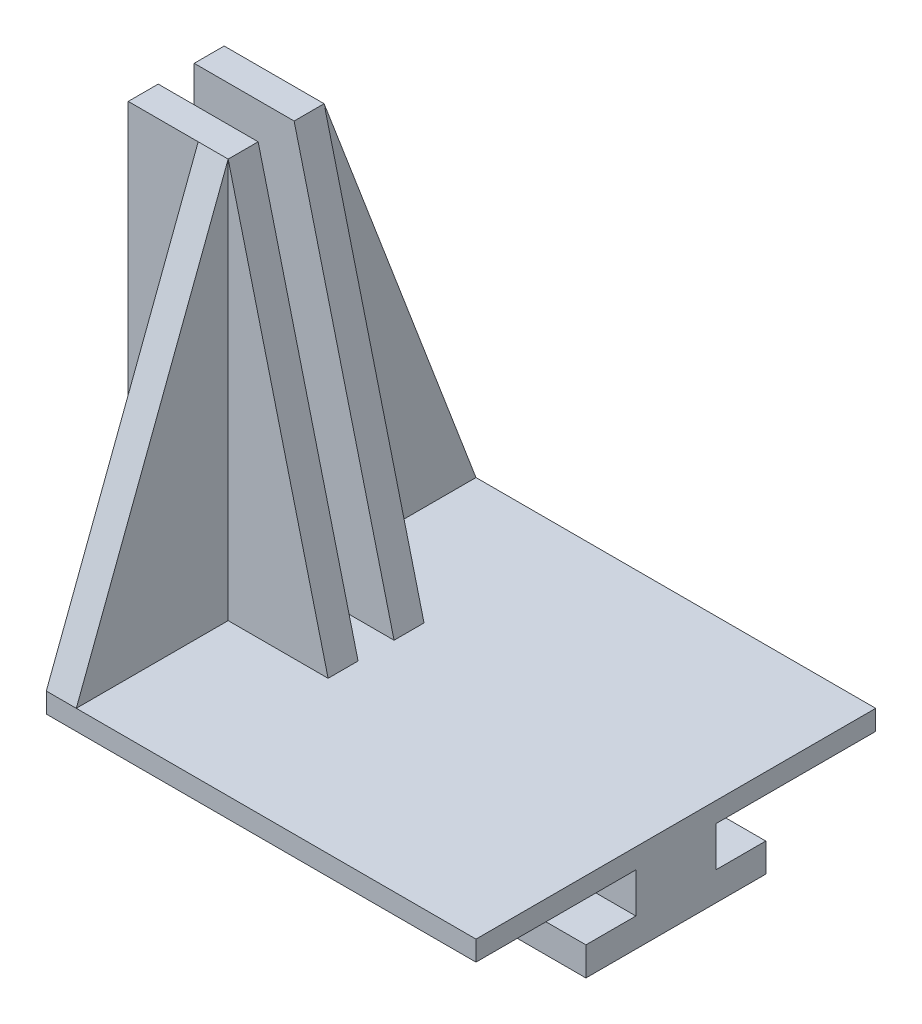
ISO-10303-21;
HEADER;
FILE_DESCRIPTION(('STEP AP214'),'2;1');
FILE_NAME('part.step','',(''),(''),'','','');
FILE_SCHEMA(('AUTOMOTIVE_DESIGN { 1 0 10303 214 1 1 1 1 }'));
ENDSEC;
DATA;
#1=APPLICATION_CONTEXT('core data for automotive mechanical design processes');
#2=APPLICATION_PROTOCOL_DEFINITION('international standard','automotive_design',2000,#1);
#3=PRODUCT_CONTEXT('',#1,'mechanical');
#4=PRODUCT('Part','Part','',(#3));
#5=PRODUCT_RELATED_PRODUCT_CATEGORY('part','',(#4));
#6=PRODUCT_DEFINITION_FORMATION('','',#4);
#7=PRODUCT_DEFINITION_CONTEXT('part definition',#1,'design');
#8=PRODUCT_DEFINITION('design','',#6,#7);
#9=PRODUCT_DEFINITION_SHAPE('','',#8);
#10=(LENGTH_UNIT() NAMED_UNIT(*) SI_UNIT(.MILLI.,.METRE.));
#11=(NAMED_UNIT(*) PLANE_ANGLE_UNIT() SI_UNIT($,.RADIAN.));
#12=(NAMED_UNIT(*) SI_UNIT($,.STERADIAN.) SOLID_ANGLE_UNIT());
#13=UNCERTAINTY_MEASURE_WITH_UNIT(LENGTH_MEASURE(1.E-05),#10,'distance_accuracy_value','');
#14=(GEOMETRIC_REPRESENTATION_CONTEXT(3) GLOBAL_UNCERTAINTY_ASSIGNED_CONTEXT((#13)) GLOBAL_UNIT_ASSIGNED_CONTEXT((#10,
#11,#12)) REPRESENTATION_CONTEXT('',''));
#15=CARTESIAN_POINT('',(0.,0.,0.));
#16=DIRECTION('',(0.,0.,1.));
#17=DIRECTION('',(1.,0.,0.));
#18=AXIS2_PLACEMENT_3D('',#15,#16,#17);
#19=CARTESIAN_POINT('',(0.,1.,0.));
#20=DIRECTION('',(0.,-1.,0.));
#21=DIRECTION('',(0.,0.,-1.));
#22=AXIS2_PLACEMENT_3D('',#19,#20,#21);
#23=PLANE('',#22);
#24=DIRECTION('',(-1.,0.,0.));
#25=VECTOR('',#24,1.);
#26=CARTESIAN_POINT('',(-5.,1.,0.899999999999999));
#27=LINE('',#26,#25);
#28=CARTESIAN_POINT('',(-5.,1.,0.899999999999999));
#29=VERTEX_POINT('',#28);
#30=CARTESIAN_POINT('',(-10.,1.,0.899999999999998));
#31=VERTEX_POINT('',#30);
#32=EDGE_CURVE('E248',#29,#31,#27,.T.);
#33=ORIENTED_EDGE('',*,*,#32,.F.);
#34=DIRECTION('',(0.,0.,1.));
#35=VECTOR('',#34,1.);
#36=CARTESIAN_POINT('',(-5.,1.,0.));
#37=LINE('',#36,#35);
#38=CARTESIAN_POINT('',(-5.,1.,2.4));
#39=VERTEX_POINT('',#38);
#40=EDGE_CURVE('E59',#29,#39,#37,.T.);
#41=ORIENTED_EDGE('',*,*,#40,.T.);
#42=DIRECTION('',(-1.,0.,0.));
#43=VECTOR('',#42,1.);
#44=CARTESIAN_POINT('',(-5.,1.,2.4));
#45=LINE('',#44,#43);
#46=CARTESIAN_POINT('',(-10.,1.,2.39999999999999));
#47=VERTEX_POINT('',#46);
#48=EDGE_CURVE('E269',#39,#47,#45,.T.);
#49=ORIENTED_EDGE('',*,*,#48,.T.);
#50=DIRECTION('',(0.,0.,-1.));
#51=VECTOR('',#50,1.);
#52=CARTESIAN_POINT('',(-10.,1.,10.));
#53=LINE('',#52,#51);
#54=CARTESIAN_POINT('',(-9.99999999999999,1.,10.));
#55=VERTEX_POINT('',#54);
#56=EDGE_CURVE('E291',#55,#47,#53,.T.);
#57=ORIENTED_EDGE('',*,*,#56,.F.);
#58=DIRECTION('',(1.,0.,0.));
#59=VECTOR('',#58,1.);
#60=CARTESIAN_POINT('',(10.,1.,10.));
#61=LINE('',#60,#59);
#62=CARTESIAN_POINT('',(10.,1.,10.));
#63=VERTEX_POINT('',#62);
#64=EDGE_CURVE('E420',#55,#63,#61,.T.);
#65=ORIENTED_EDGE('',*,*,#64,.T.);
#66=DIRECTION('',(0.,0.,-1.));
#67=VECTOR('',#66,1.);
#68=CARTESIAN_POINT('',(10.,1.,-10.));
#69=LINE('',#68,#67);
#70=CARTESIAN_POINT('',(10.,1.,-10.));
#71=VERTEX_POINT('',#70);
#72=EDGE_CURVE('E423',#63,#71,#69,.T.);
#73=ORIENTED_EDGE('',*,*,#72,.T.);
#74=DIRECTION('',(-1.,0.,0.));
#75=VECTOR('',#74,1.);
#76=CARTESIAN_POINT('',(10.,1.,-10.));
#77=LINE('',#76,#75);
#78=CARTESIAN_POINT('',(-10.,1.,-10.));
#79=VERTEX_POINT('',#78);
#80=EDGE_CURVE('E425',#71,#79,#77,.T.);
#81=ORIENTED_EDGE('',*,*,#80,.T.);
#82=DIRECTION('',(0.,0.,1.));
#83=VECTOR('',#82,1.);
#84=CARTESIAN_POINT('',(-10.,1.,-10.));
#85=LINE('',#84,#83);
#86=CARTESIAN_POINT('',(-10.,1.,-2.4));
#87=VERTEX_POINT('',#86);
#88=EDGE_CURVE('E396',#79,#87,#85,.T.);
#89=ORIENTED_EDGE('',*,*,#88,.T.);
#90=DIRECTION('',(-1.,0.,0.));
#91=VECTOR('',#90,1.);
#92=CARTESIAN_POINT('',(-5.,1.,-2.4));
#93=LINE('',#92,#91);
#94=CARTESIAN_POINT('',(-5.,1.,-2.4));
#95=VERTEX_POINT('',#94);
#96=EDGE_CURVE('E352',#95,#87,#93,.T.);
#97=ORIENTED_EDGE('',*,*,#96,.F.);
#98=DIRECTION('',(0.,0.,-1.));
#99=VECTOR('',#98,1.);
#100=CARTESIAN_POINT('',(-5.,1.,0.));
#101=LINE('',#100,#99);
#102=CARTESIAN_POINT('',(-5.,1.,-0.899999999999999));
#103=VERTEX_POINT('',#102);
#104=EDGE_CURVE('E333',#103,#95,#101,.T.);
#105=ORIENTED_EDGE('',*,*,#104,.F.);
#106=DIRECTION('',(-1.,0.,0.));
#107=VECTOR('',#106,1.);
#108=CARTESIAN_POINT('',(-5.,1.,-0.899999999999999));
#109=LINE('',#108,#107);
#110=CARTESIAN_POINT('',(-10.,1.,-0.899999999999998));
#111=VERTEX_POINT('',#110);
#112=EDGE_CURVE('E339',#103,#111,#109,.T.);
#113=ORIENTED_EDGE('',*,*,#112,.T.);
#114=EDGE_CURVE('E408',#111,#31,#85,.T.);
#115=ORIENTED_EDGE('',*,*,#114,.T.);
#116=EDGE_LOOP('',(#33,#41,#49,#57,#65,#73,#81,#89,#97,#105,#113,#115));
#117=FACE_BOUND('',#116,.T.);
#118=ADVANCED_FACE('F33',(#117),#23,.F.);
#119=CARTESIAN_POINT('',(-10.,1.,-10.));
#120=DIRECTION('',(1.,0.,0.));
#121=DIRECTION('',(0.,0.,-1.));
#122=AXIS2_PLACEMENT_3D('',#119,#120,#121);
#123=PLANE('',#122);
#124=DIRECTION('',(0.,-1.,0.));
#125=VECTOR('',#124,1.);
#126=CARTESIAN_POINT('',(-10.,0.,2.));
#127=LINE('',#126,#125);
#128=CARTESIAN_POINT('',(-10.,0.,2.));
#129=VERTEX_POINT('',#128);
#130=CARTESIAN_POINT('',(-10.,-2.,2.));
#131=VERTEX_POINT('',#130);
#132=EDGE_CURVE('E478',#129,#131,#127,.T.);
#133=ORIENTED_EDGE('',*,*,#132,.F.);
#134=DIRECTION('',(0.,0.,-1.));
#135=VECTOR('',#134,1.);
#136=CARTESIAN_POINT('',(-10.,0.,0.));
#137=LINE('',#136,#135);
#138=CARTESIAN_POINT('',(-10.,0.,0.899999999999998));
#139=VERTEX_POINT('',#138);
#140=EDGE_CURVE('E51',#129,#139,#137,.T.);
#141=ORIENTED_EDGE('',*,*,#140,.T.);
#142=DIRECTION('',(0.,1.,0.));
#143=VECTOR('',#142,1.);
#144=CARTESIAN_POINT('',(-10.,0.,0.899999999999998));
#145=LINE('',#144,#143);
#146=EDGE_CURVE('E311',#139,#31,#145,.T.);
#147=ORIENTED_EDGE('',*,*,#146,.T.);
#148=ORIENTED_EDGE('',*,*,#114,.F.);
#149=DIRECTION('',(0.,1.,0.));
#150=VECTOR('',#149,1.);
#151=CARTESIAN_POINT('',(-10.,0.,-0.899999999999998));
#152=LINE('',#151,#150);
#153=CARTESIAN_POINT('',(-10.,0.,-0.899999999999998));
#154=VERTEX_POINT('',#153);
#155=EDGE_CURVE('E37',#154,#111,#152,.T.);
#156=ORIENTED_EDGE('',*,*,#155,.F.);
#157=DIRECTION('',(0.,0.,1.));
#158=VECTOR('',#157,1.);
#159=CARTESIAN_POINT('',(-10.,0.,0.));
#160=LINE('',#159,#158);
#161=CARTESIAN_POINT('',(-10.,0.,-2.));
#162=VERTEX_POINT('',#161);
#163=EDGE_CURVE('E11',#162,#154,#160,.T.);
#164=ORIENTED_EDGE('',*,*,#163,.F.);
#165=DIRECTION('',(0.,1.,0.));
#166=VECTOR('',#165,1.);
#167=CARTESIAN_POINT('',(-10.,-2.,-2.));
#168=LINE('',#167,#166);
#169=CARTESIAN_POINT('',(-10.,-2.,-2.));
#170=VERTEX_POINT('',#169);
#171=EDGE_CURVE('E490',#170,#162,#168,.T.);
#172=ORIENTED_EDGE('',*,*,#171,.F.);
#173=DIRECTION('',(0.,0.,1.));
#174=VECTOR('',#173,1.);
#175=CARTESIAN_POINT('',(-10.,-2.,-4.5));
#176=LINE('',#175,#174);
#177=CARTESIAN_POINT('',(-10.,-2.,-4.5));
#178=VERTEX_POINT('',#177);
#179=EDGE_CURVE('E487',#178,#170,#176,.T.);
#180=ORIENTED_EDGE('',*,*,#179,.F.);
#181=DIRECTION('',(0.,1.,0.));
#182=VECTOR('',#181,1.);
#183=CARTESIAN_POINT('',(-10.,-3.43610218622617,-4.5));
#184=LINE('',#183,#182);
#185=CARTESIAN_POINT('',(-10.,-3.43610218622617,-4.5));
#186=VERTEX_POINT('',#185);
#187=EDGE_CURVE('E484',#186,#178,#184,.T.);
#188=ORIENTED_EDGE('',*,*,#187,.F.);
#189=DIRECTION('',(0.,0.,-1.));
#190=VECTOR('',#189,1.);
#191=CARTESIAN_POINT('',(-10.,-3.43610218622617,4.5));
#192=LINE('',#191,#190);
#193=CARTESIAN_POINT('',(-10.,-3.43610218622617,4.5));
#194=VERTEX_POINT('',#193);
#195=EDGE_CURVE('E481',#194,#186,#192,.T.);
#196=ORIENTED_EDGE('',*,*,#195,.F.);
#197=DIRECTION('',(0.,-1.,0.));
#198=VECTOR('',#197,1.);
#199=CARTESIAN_POINT('',(-10.,-2.,4.5));
#200=LINE('',#199,#198);
#201=CARTESIAN_POINT('',(-10.,-2.,4.5));
#202=VERTEX_POINT('',#201);
#203=EDGE_CURVE('E477',#202,#194,#200,.T.);
#204=ORIENTED_EDGE('',*,*,#203,.F.);
#205=DIRECTION('',(0.,0.,1.));
#206=VECTOR('',#205,1.);
#207=CARTESIAN_POINT('',(-10.,-2.,2.));
#208=LINE('',#207,#206);
#209=EDGE_CURVE('E474',#131,#202,#208,.T.);
#210=ORIENTED_EDGE('',*,*,#209,.F.);
#211=EDGE_LOOP('',(#133,#141,#147,#148,#156,#164,#172,#180,#188,#196,#204,#210));
#212=FACE_BOUND('',#211,.T.);
#213=ADVANCED_FACE('F35',(#212),#123,.F.);
#214=CARTESIAN_POINT('',(0.,0.,0.));
#215=DIRECTION('',(0.,-1.,0.));
#216=DIRECTION('',(0.,0.,-1.));
#217=AXIS2_PLACEMENT_3D('',#214,#215,#216);
#218=PLANE('',#217);
#219=DIRECTION('',(1.,0.,0.));
#220=VECTOR('',#219,1.);
#221=CARTESIAN_POINT('',(10.,0.,10.));
#222=LINE('',#221,#220);
#223=CARTESIAN_POINT('',(-11.5,0.,10.));
#224=VERTEX_POINT('',#223);
#225=CARTESIAN_POINT('',(10.,0.,10.));
#226=VERTEX_POINT('',#225);
#227=EDGE_CURVE('E428',#224,#226,#222,.T.);
#228=ORIENTED_EDGE('',*,*,#227,.F.);
#229=DIRECTION('',(0.,0.,-1.));
#230=VECTOR('',#229,1.);
#231=CARTESIAN_POINT('',(-11.5,0.,0.));
#232=LINE('',#231,#230);
#233=CARTESIAN_POINT('',(-11.5,0.,0.899999999999998));
#234=VERTEX_POINT('',#233);
#235=EDGE_CURVE('E609',#224,#234,#232,.T.);
#236=ORIENTED_EDGE('',*,*,#235,.T.);
#237=DIRECTION('',(1.,0.,0.));
#238=VECTOR('',#237,1.);
#239=CARTESIAN_POINT('',(-11.5,0.,0.899999999999998));
#240=LINE('',#239,#238);
#241=EDGE_CURVE('E308',#234,#139,#240,.T.);
#242=ORIENTED_EDGE('',*,*,#241,.T.);
#243=ORIENTED_EDGE('',*,*,#140,.F.);
#244=DIRECTION('',(1.,0.,0.));
#245=VECTOR('',#244,1.);
#246=CARTESIAN_POINT('',(-10.,0.,2.));
#247=LINE('',#246,#245);
#248=CARTESIAN_POINT('',(10.,0.,2.));
#249=VERTEX_POINT('',#248);
#250=EDGE_CURVE('E431',#129,#249,#247,.T.);
#251=ORIENTED_EDGE('',*,*,#250,.T.);
#252=DIRECTION('',(0.,0.,-1.));
#253=VECTOR('',#252,1.);
#254=CARTESIAN_POINT('',(10.,0.,-10.));
#255=LINE('',#254,#253);
#256=EDGE_CURVE('E439',#226,#249,#255,.T.);
#257=ORIENTED_EDGE('',*,*,#256,.F.);
#258=EDGE_LOOP('',(#228,#236,#242,#243,#251,#257));
#259=FACE_BOUND('',#258,.T.);
#260=ADVANCED_FACE('F548',(#259),#218,.T.);
#261=CARTESIAN_POINT('',(10.,1.,10.));
#262=DIRECTION('',(0.,0.,-1.));
#263=DIRECTION('',(-1.,0.,0.));
#264=AXIS2_PLACEMENT_3D('',#261,#262,#263);
#265=PLANE('',#264);
#266=ORIENTED_EDGE('',*,*,#227,.T.);
#267=DIRECTION('',(0.,-1.,0.));
#268=VECTOR('',#267,1.);
#269=CARTESIAN_POINT('',(10.,1.,10.));
#270=LINE('',#269,#268);
#271=EDGE_CURVE('E43',#63,#226,#270,.T.);
#272=ORIENTED_EDGE('',*,*,#271,.F.);
#273=ORIENTED_EDGE('',*,*,#64,.F.);
#274=DIRECTION('',(1.,0.,0.));
#275=VECTOR('',#274,1.);
#276=CARTESIAN_POINT('',(-11.5,1.,10.));
#277=LINE('',#276,#275);
#278=CARTESIAN_POINT('',(-11.5,1.,10.));
#279=VERTEX_POINT('',#278);
#280=EDGE_CURVE('E296',#279,#55,#277,.T.);
#281=ORIENTED_EDGE('',*,*,#280,.F.);
#282=DIRECTION('',(0.,-1.,0.));
#283=VECTOR('',#282,1.);
#284=CARTESIAN_POINT('',(-11.5,0.,10.));
#285=LINE('',#284,#283);
#286=EDGE_CURVE('E606',#279,#224,#285,.T.);
#287=ORIENTED_EDGE('',*,*,#286,.T.);
#288=EDGE_LOOP('',(#266,#272,#273,#281,#287));
#289=FACE_BOUND('',#288,.T.);
#290=ADVANCED_FACE('F598',(#289),#265,.F.);
#291=CARTESIAN_POINT('',(10.,1.,-10.));
#292=DIRECTION('',(-1.,0.,0.));
#293=DIRECTION('',(0.,0.,1.));
#294=AXIS2_PLACEMENT_3D('',#291,#292,#293);
#295=PLANE('',#294);
#296=ORIENTED_EDGE('',*,*,#256,.T.);
#297=DIRECTION('',(0.,-1.,0.));
#298=VECTOR('',#297,1.);
#299=CARTESIAN_POINT('',(10.,0.,2.));
#300=LINE('',#299,#298);
#301=CARTESIAN_POINT('',(10.,-2.,2.));
#302=VERTEX_POINT('',#301);
#303=EDGE_CURVE('E388',#249,#302,#300,.T.);
#304=ORIENTED_EDGE('',*,*,#303,.T.);
#305=DIRECTION('',(0.,0.,1.));
#306=VECTOR('',#305,1.);
#307=CARTESIAN_POINT('',(10.,-2.,2.));
#308=LINE('',#307,#306);
#309=CARTESIAN_POINT('',(10.,-2.,4.5));
#310=VERTEX_POINT('',#309);
#311=EDGE_CURVE('E491',#302,#310,#308,.T.);
#312=ORIENTED_EDGE('',*,*,#311,.T.);
#313=DIRECTION('',(0.,-1.,0.));
#314=VECTOR('',#313,1.);
#315=CARTESIAN_POINT('',(10.,-2.,4.5));
#316=LINE('',#315,#314);
#317=CARTESIAN_POINT('',(10.,-3.43610218622617,4.5));
#318=VERTEX_POINT('',#317);
#319=EDGE_CURVE('E494',#310,#318,#316,.T.);
#320=ORIENTED_EDGE('',*,*,#319,.T.);
#321=DIRECTION('',(0.,0.,-1.));
#322=VECTOR('',#321,1.);
#323=CARTESIAN_POINT('',(10.,-3.43610218622617,4.5));
#324=LINE('',#323,#322);
#325=CARTESIAN_POINT('',(10.,-3.43610218622617,-4.5));
#326=VERTEX_POINT('',#325);
#327=EDGE_CURVE('E497',#318,#326,#324,.T.);
#328=ORIENTED_EDGE('',*,*,#327,.T.);
#329=DIRECTION('',(0.,1.,0.));
#330=VECTOR('',#329,1.);
#331=CARTESIAN_POINT('',(10.,-3.43610218622617,-4.5));
#332=LINE('',#331,#330);
#333=CARTESIAN_POINT('',(10.,-2.,-4.5));
#334=VERTEX_POINT('',#333);
#335=EDGE_CURVE('E500',#326,#334,#332,.T.);
#336=ORIENTED_EDGE('',*,*,#335,.T.);
#337=DIRECTION('',(0.,0.,1.));
#338=VECTOR('',#337,1.);
#339=CARTESIAN_POINT('',(10.,-2.,-4.5));
#340=LINE('',#339,#338);
#341=CARTESIAN_POINT('',(10.,-2.,-2.));
#342=VERTEX_POINT('',#341);
#343=EDGE_CURVE('E503',#334,#342,#340,.T.);
#344=ORIENTED_EDGE('',*,*,#343,.T.);
#345=DIRECTION('',(0.,1.,0.));
#346=VECTOR('',#345,1.);
#347=CARTESIAN_POINT('',(10.,-2.,-2.));
#348=LINE('',#347,#346);
#349=CARTESIAN_POINT('',(10.,0.,-2.));
#350=VERTEX_POINT('',#349);
#351=EDGE_CURVE('E506',#342,#350,#348,.T.);
#352=ORIENTED_EDGE('',*,*,#351,.T.);
#353=CARTESIAN_POINT('',(10.,0.,-10.));
#354=VERTEX_POINT('',#353);
#355=EDGE_CURVE('E430',#350,#354,#255,.T.);
#356=ORIENTED_EDGE('',*,*,#355,.T.);
#357=DIRECTION('',(0.,-1.,0.));
#358=VECTOR('',#357,1.);
#359=CARTESIAN_POINT('',(10.,1.,-10.));
#360=LINE('',#359,#358);
#361=EDGE_CURVE('E427',#71,#354,#360,.T.);
#362=ORIENTED_EDGE('',*,*,#361,.F.);
#363=ORIENTED_EDGE('',*,*,#72,.F.);
#364=ORIENTED_EDGE('',*,*,#271,.T.);
#365=EDGE_LOOP('',(#296,#304,#312,#320,#328,#336,#344,#352,#356,#362,#363,#364));
#366=FACE_BOUND('',#365,.T.);
#367=ADVANCED_FACE('F530',(#366),#295,.F.);
#368=CARTESIAN_POINT('',(10.,1.,-10.));
#369=DIRECTION('',(0.,0.,1.));
#370=DIRECTION('',(1.,0.,0.));
#371=AXIS2_PLACEMENT_3D('',#368,#369,#370);
#372=PLANE('',#371);
#373=DIRECTION('',(-1.,0.,0.));
#374=VECTOR('',#373,1.);
#375=CARTESIAN_POINT('',(10.,0.,-10.));
#376=LINE('',#375,#374);
#377=CARTESIAN_POINT('',(-11.5,0.,-10.));
#378=VERTEX_POINT('',#377);
#379=EDGE_CURVE('E413',#354,#378,#376,.T.);
#380=ORIENTED_EDGE('',*,*,#379,.T.);
#381=DIRECTION('',(0.,-1.,0.));
#382=VECTOR('',#381,1.);
#383=CARTESIAN_POINT('',(-11.5,0.,-10.));
#384=LINE('',#383,#382);
#385=CARTESIAN_POINT('',(-11.5,1.,-10.));
#386=VERTEX_POINT('',#385);
#387=EDGE_CURVE('E464',#386,#378,#384,.T.);
#388=ORIENTED_EDGE('',*,*,#387,.F.);
#389=DIRECTION('',(1.,0.,0.));
#390=VECTOR('',#389,1.);
#391=CARTESIAN_POINT('',(-11.5,1.,-10.));
#392=LINE('',#391,#390);
#393=EDGE_CURVE('E389',#386,#79,#392,.T.);
#394=ORIENTED_EDGE('',*,*,#393,.T.);
#395=ORIENTED_EDGE('',*,*,#80,.F.);
#396=ORIENTED_EDGE('',*,*,#361,.T.);
#397=EDGE_LOOP('',(#380,#388,#394,#395,#396));
#398=FACE_BOUND('',#397,.T.);
#399=ADVANCED_FACE('F448',(#398),#372,.F.);
#400=DIRECTION('',(1.,0.,0.));
#401=VECTOR('',#400,1.);
#402=CARTESIAN_POINT('',(-10.,0.,-2.));
#403=LINE('',#402,#401);
#404=EDGE_CURVE('E515',#162,#350,#403,.T.);
#405=ORIENTED_EDGE('',*,*,#404,.F.);
#406=ORIENTED_EDGE('',*,*,#163,.T.);
#407=DIRECTION('',(1.,0.,0.));
#408=VECTOR('',#407,1.);
#409=CARTESIAN_POINT('',(-11.5,0.,-0.899999999999998));
#410=LINE('',#409,#408);
#411=CARTESIAN_POINT('',(-11.5,0.,-0.899999999999998));
#412=VERTEX_POINT('',#411);
#413=EDGE_CURVE('E461',#412,#154,#410,.T.);
#414=ORIENTED_EDGE('',*,*,#413,.F.);
#415=DIRECTION('',(0.,0.,1.));
#416=VECTOR('',#415,1.);
#417=CARTESIAN_POINT('',(-11.5,0.,0.));
#418=LINE('',#417,#416);
#419=EDGE_CURVE('E459',#378,#412,#418,.T.);
#420=ORIENTED_EDGE('',*,*,#419,.F.);
#421=ORIENTED_EDGE('',*,*,#379,.F.);
#422=ORIENTED_EDGE('',*,*,#355,.F.);
#423=EDGE_LOOP('',(#405,#406,#414,#420,#421,#422));
#424=FACE_BOUND('',#423,.T.);
#425=ADVANCED_FACE('F457',(#424),#218,.T.);
#426=CARTESIAN_POINT('',(-10.,0.,2.));
#427=DIRECTION('',(0.,0.,1.));
#428=DIRECTION('',(0.,-1.,0.));
#429=AXIS2_PLACEMENT_3D('',#426,#427,#428);
#430=PLANE('',#429);
#431=ORIENTED_EDGE('',*,*,#303,.F.);
#432=ORIENTED_EDGE('',*,*,#250,.F.);
#433=ORIENTED_EDGE('',*,*,#132,.T.);
#434=DIRECTION('',(1.,0.,0.));
#435=VECTOR('',#434,1.);
#436=CARTESIAN_POINT('',(-10.,-2.,2.));
#437=LINE('',#436,#435);
#438=EDGE_CURVE('E418',#131,#302,#437,.T.);
#439=ORIENTED_EDGE('',*,*,#438,.T.);
#440=EDGE_LOOP('',(#431,#432,#433,#439));
#441=FACE_BOUND('',#440,.T.);
#442=ADVANCED_FACE('F552',(#441),#430,.T.);
#443=CARTESIAN_POINT('',(-10.,-2.,-2.));
#444=DIRECTION('',(0.,0.,-1.));
#445=DIRECTION('',(-1.,0.,0.));
#446=AXIS2_PLACEMENT_3D('',#443,#444,#445);
#447=PLANE('',#446);
#448=ORIENTED_EDGE('',*,*,#351,.F.);
#449=DIRECTION('',(1.,0.,0.));
#450=VECTOR('',#449,1.);
#451=CARTESIAN_POINT('',(-10.,-2.,-2.));
#452=LINE('',#451,#450);
#453=EDGE_CURVE('E522',#170,#342,#452,.T.);
#454=ORIENTED_EDGE('',*,*,#453,.F.);
#455=ORIENTED_EDGE('',*,*,#171,.T.);
#456=ORIENTED_EDGE('',*,*,#404,.T.);
#457=EDGE_LOOP('',(#448,#454,#455,#456));
#458=FACE_BOUND('',#457,.T.);
#459=ADVANCED_FACE('F533',(#458),#447,.T.);
#460=CARTESIAN_POINT('',(-10.,-2.,-4.5));
#461=DIRECTION('',(0.,1.,0.));
#462=DIRECTION('',(0.,0.,1.));
#463=AXIS2_PLACEMENT_3D('',#460,#461,#462);
#464=PLANE('',#463);
#465=ORIENTED_EDGE('',*,*,#343,.F.);
#466=DIRECTION('',(1.,0.,0.));
#467=VECTOR('',#466,1.);
#468=CARTESIAN_POINT('',(-10.,-2.,-4.5));
#469=LINE('',#468,#467);
#470=EDGE_CURVE('E566',#178,#334,#469,.T.);
#471=ORIENTED_EDGE('',*,*,#470,.F.);
#472=ORIENTED_EDGE('',*,*,#179,.T.);
#473=ORIENTED_EDGE('',*,*,#453,.T.);
#474=EDGE_LOOP('',(#465,#471,#472,#473));
#475=FACE_BOUND('',#474,.T.);
#476=ADVANCED_FACE('F568',(#475),#464,.T.);
#477=CARTESIAN_POINT('',(-10.,-3.43610218622617,-4.5));
#478=DIRECTION('',(0.,0.,-1.));
#479=DIRECTION('',(-1.,0.,0.));
#480=AXIS2_PLACEMENT_3D('',#477,#478,#479);
#481=PLANE('',#480);
#482=ORIENTED_EDGE('',*,*,#335,.F.);
#483=DIRECTION('',(1.,0.,0.));
#484=VECTOR('',#483,1.);
#485=CARTESIAN_POINT('',(-10.,-3.43610218622617,-4.5));
#486=LINE('',#485,#484);
#487=EDGE_CURVE('E562',#186,#326,#486,.T.);
#488=ORIENTED_EDGE('',*,*,#487,.F.);
#489=ORIENTED_EDGE('',*,*,#187,.T.);
#490=ORIENTED_EDGE('',*,*,#470,.T.);
#491=EDGE_LOOP('',(#482,#488,#489,#490));
#492=FACE_BOUND('',#491,.T.);
#493=ADVANCED_FACE('F572',(#492),#481,.T.);
#494=CARTESIAN_POINT('',(-10.,-3.43610218622617,4.5));
#495=DIRECTION('',(0.,-1.,0.));
#496=DIRECTION('',(0.,0.,-1.));
#497=AXIS2_PLACEMENT_3D('',#494,#495,#496);
#498=PLANE('',#497);
#499=ORIENTED_EDGE('',*,*,#327,.F.);
#500=DIRECTION('',(1.,0.,0.));
#501=VECTOR('',#500,1.);
#502=CARTESIAN_POINT('',(-10.,-3.43610218622617,4.5));
#503=LINE('',#502,#501);
#504=EDGE_CURVE('E561',#194,#318,#503,.T.);
#505=ORIENTED_EDGE('',*,*,#504,.F.);
#506=ORIENTED_EDGE('',*,*,#195,.T.);
#507=ORIENTED_EDGE('',*,*,#487,.T.);
#508=EDGE_LOOP('',(#499,#505,#506,#507));
#509=FACE_BOUND('',#508,.T.);
#510=ADVANCED_FACE('F575',(#509),#498,.T.);
#511=CARTESIAN_POINT('',(-10.,-2.,4.5));
#512=DIRECTION('',(0.,0.,1.));
#513=DIRECTION('',(1.,0.,0.));
#514=AXIS2_PLACEMENT_3D('',#511,#512,#513);
#515=PLANE('',#514);
#516=ORIENTED_EDGE('',*,*,#319,.F.);
#517=DIRECTION('',(1.,0.,0.));
#518=VECTOR('',#517,1.);
#519=CARTESIAN_POINT('',(-10.,-2.,4.5));
#520=LINE('',#519,#518);
#521=EDGE_CURVE('E559',#202,#310,#520,.T.);
#522=ORIENTED_EDGE('',*,*,#521,.F.);
#523=ORIENTED_EDGE('',*,*,#203,.T.);
#524=ORIENTED_EDGE('',*,*,#504,.T.);
#525=EDGE_LOOP('',(#516,#522,#523,#524));
#526=FACE_BOUND('',#525,.T.);
#527=ADVANCED_FACE('F577',(#526),#515,.T.);
#528=CARTESIAN_POINT('',(-10.,-2.,2.));
#529=DIRECTION('',(0.,1.,0.));
#530=DIRECTION('',(0.,0.,1.));
#531=AXIS2_PLACEMENT_3D('',#528,#529,#530);
#532=PLANE('',#531);
#533=ORIENTED_EDGE('',*,*,#311,.F.);
#534=ORIENTED_EDGE('',*,*,#438,.F.);
#535=ORIENTED_EDGE('',*,*,#209,.T.);
#536=ORIENTED_EDGE('',*,*,#521,.T.);
#537=EDGE_LOOP('',(#533,#534,#535,#536));
#538=FACE_BOUND('',#537,.T.);
#539=ADVANCED_FACE('F558',(#538),#532,.T.);
#540=CARTESIAN_POINT('',(-11.5,3.44669695910521,-9.07025515554002));
#541=DIRECTION('',(0.,-0.355217760623572,0.934783580588349));
#542=DIRECTION('',(0.,-0.934783580588349,-0.355217760623572));
#543=AXIS2_PLACEMENT_3D('',#540,#541,#542);
#544=PLANE('',#543);
#545=DIRECTION('',(0.,-0.934783580588349,-0.355217760623573));
#546=VECTOR('',#545,1.);
#547=CARTESIAN_POINT('',(-10.,3.44669695910521,-9.07025515554002));
#548=LINE('',#547,#546);
#549=CARTESIAN_POINT('',(-9.99999999999999,21.,-2.4));
#550=VERTEX_POINT('',#549);
#551=EDGE_CURVE('E384',#550,#79,#548,.T.);
#552=ORIENTED_EDGE('',*,*,#551,.T.);
#553=ORIENTED_EDGE('',*,*,#393,.F.);
#554=DIRECTION('',(0.,-0.934783580588349,-0.355217760623573));
#555=VECTOR('',#554,1.);
#556=CARTESIAN_POINT('',(-11.5,3.44669695910521,-9.07025515554002));
#557=LINE('',#556,#555);
#558=CARTESIAN_POINT('',(-11.5,21.,-2.4));
#559=VERTEX_POINT('',#558);
#560=EDGE_CURVE('E386',#559,#386,#557,.T.);
#561=ORIENTED_EDGE('',*,*,#560,.F.);
#562=DIRECTION('',(1.,0.,0.));
#563=VECTOR('',#562,1.);
#564=CARTESIAN_POINT('',(-11.5,21.,-2.4));
#565=LINE('',#564,#563);
#566=EDGE_CURVE('E361',#559,#550,#565,.T.);
#567=ORIENTED_EDGE('',*,*,#566,.T.);
#568=EDGE_LOOP('',(#552,#553,#561,#567));
#569=FACE_BOUND('',#568,.T.);
#570=ADVANCED_FACE('F382',(#569),#544,.F.);
#571=CARTESIAN_POINT('',(-11.5,0.,-0.899999999999998));
#572=DIRECTION('',(0.,0.,-1.));
#573=DIRECTION('',(-1.,0.,0.));
#574=AXIS2_PLACEMENT_3D('',#571,#572,#573);
#575=PLANE('',#574);
#576=ORIENTED_EDGE('',*,*,#155,.T.);
#577=ORIENTED_EDGE('',*,*,#112,.F.);
#578=DIRECTION('',(0.242535625036333,-0.970142500145332,0.));
#579=VECTOR('',#578,1.);
#580=CARTESIAN_POINT('',(-5.,1.,-0.9));
#581=LINE('',#580,#579);
#582=CARTESIAN_POINT('',(-9.99999999999999,21.,-0.9));
#583=VERTEX_POINT('',#582);
#584=EDGE_CURVE('E294',#583,#103,#581,.T.);
#585=ORIENTED_EDGE('',*,*,#584,.F.);
#586=DIRECTION('',(-1.,0.,0.));
#587=VECTOR('',#586,1.);
#588=CARTESIAN_POINT('',(-5.,21.,-0.899999999999999));
#589=LINE('',#588,#587);
#590=CARTESIAN_POINT('',(-15.,21.,-0.899999999999997));
#591=VERTEX_POINT('',#590);
#592=EDGE_CURVE('E336',#583,#591,#589,.T.);
#593=ORIENTED_EDGE('',*,*,#592,.T.);
#594=DIRECTION('',(0.,1.,0.));
#595=VECTOR('',#594,1.);
#596=CARTESIAN_POINT('',(-15.,0.,-0.899999999999997));
#597=LINE('',#596,#595);
#598=CARTESIAN_POINT('',(-15.,1.,-0.899999999999997));
#599=VERTEX_POINT('',#598);
#600=EDGE_CURVE('E330',#599,#591,#597,.T.);
#601=ORIENTED_EDGE('',*,*,#600,.F.);
#602=CARTESIAN_POINT('',(-11.5,1.,-0.899999999999998));
#603=VERTEX_POINT('',#602);
#604=EDGE_CURVE('E346',#603,#599,#109,.T.);
#605=ORIENTED_EDGE('',*,*,#604,.F.);
#606=DIRECTION('',(0.,1.,0.));
#607=VECTOR('',#606,1.);
#608=CARTESIAN_POINT('',(-11.5,0.,-0.899999999999998));
#609=LINE('',#608,#607);
#610=EDGE_CURVE('E463',#412,#603,#609,.T.);
#611=ORIENTED_EDGE('',*,*,#610,.F.);
#612=ORIENTED_EDGE('',*,*,#413,.T.);
#613=EDGE_LOOP('',(#576,#577,#585,#593,#601,#605,#611,#612));
#614=FACE_BOUND('',#613,.T.);
#615=ADVANCED_FACE('F373',(#614),#575,.F.);
#616=CARTESIAN_POINT('',(-11.5,0.,0.));
#617=DIRECTION('',(-1.,0.,0.));
#618=DIRECTION('',(0.,0.,1.));
#619=AXIS2_PLACEMENT_3D('',#616,#617,#618);
#620=PLANE('',#619);
#621=DIRECTION('',(0.,-1.,0.));
#622=VECTOR('',#621,1.);
#623=CARTESIAN_POINT('',(-11.5,0.,-2.39999999999999));
#624=LINE('',#623,#622);
#625=CARTESIAN_POINT('',(-11.5,1.,-2.4));
#626=VERTEX_POINT('',#625);
#627=EDGE_CURVE('E398',#559,#626,#624,.T.);
#628=ORIENTED_EDGE('',*,*,#627,.F.);
#629=ORIENTED_EDGE('',*,*,#560,.T.);
#630=ORIENTED_EDGE('',*,*,#387,.T.);
#631=ORIENTED_EDGE('',*,*,#419,.T.);
#632=ORIENTED_EDGE('',*,*,#610,.T.);
#633=DIRECTION('',(0.,0.,-1.));
#634=VECTOR('',#633,1.);
#635=CARTESIAN_POINT('',(-11.5,1.,0.));
#636=LINE('',#635,#634);
#637=EDGE_CURVE('E402',#603,#626,#636,.T.);
#638=ORIENTED_EDGE('',*,*,#637,.T.);
#639=EDGE_LOOP('',(#628,#629,#630,#631,#632,#638));
#640=FACE_BOUND('',#639,.T.);
#641=ADVANCED_FACE('F471',(#640),#620,.T.);
#642=CARTESIAN_POINT('',(-10.,0.,0.));
#643=DIRECTION('',(-1.,0.,0.));
#644=DIRECTION('',(0.,0.,1.));
#645=AXIS2_PLACEMENT_3D('',#642,#643,#644);
#646=PLANE('',#645);
#647=ORIENTED_EDGE('',*,*,#88,.F.);
#648=ORIENTED_EDGE('',*,*,#551,.F.);
#649=DIRECTION('',(0.,-1.,0.));
#650=VECTOR('',#649,1.);
#651=CARTESIAN_POINT('',(-10.,0.,-2.39999999999999));
#652=LINE('',#651,#650);
#653=EDGE_CURVE('E338',#550,#87,#652,.T.);
#654=ORIENTED_EDGE('',*,*,#653,.T.);
#655=EDGE_LOOP('',(#647,#648,#654));
#656=FACE_BOUND('',#655,.T.);
#657=ADVANCED_FACE('F394',(#656),#646,.F.);
#658=CARTESIAN_POINT('',(-5.,0.,-2.4));
#659=DIRECTION('',(0.,0.,-1.));
#660=DIRECTION('',(-1.,0.,0.));
#661=AXIS2_PLACEMENT_3D('',#658,#659,#660);
#662=PLANE('',#661);
#663=ORIENTED_EDGE('',*,*,#653,.F.);
#664=DIRECTION('',(-0.242535625036333,0.970142500145332,0.));
#665=VECTOR('',#664,1.);
#666=CARTESIAN_POINT('',(-4.76470588235294,0.0588235294117643,-2.4));
#667=LINE('',#666,#665);
#668=EDGE_CURVE('E318',#95,#550,#667,.T.);
#669=ORIENTED_EDGE('',*,*,#668,.F.);
#670=ORIENTED_EDGE('',*,*,#96,.T.);
#671=EDGE_LOOP('',(#663,#669,#670));
#672=FACE_BOUND('',#671,.T.);
#673=ADVANCED_FACE('F542',(#672),#662,.T.);
#674=CARTESIAN_POINT('',(-5.,21.,0.));
#675=DIRECTION('',(0.,1.,0.));
#676=DIRECTION('',(0.,0.,1.));
#677=AXIS2_PLACEMENT_3D('',#674,#675,#676);
#678=PLANE('',#677);
#679=DIRECTION('',(0.,0.,1.));
#680=VECTOR('',#679,1.);
#681=CARTESIAN_POINT('',(-9.99999999999999,21.,-5.9));
#682=LINE('',#681,#680);
#683=EDGE_CURVE('E316',#550,#583,#682,.T.);
#684=ORIENTED_EDGE('',*,*,#683,.F.);
#685=ORIENTED_EDGE('',*,*,#566,.F.);
#686=DIRECTION('',(-1.,0.,0.));
#687=VECTOR('',#686,1.);
#688=CARTESIAN_POINT('',(-5.,21.,-2.4));
#689=LINE('',#688,#687);
#690=CARTESIAN_POINT('',(-15.,21.,-2.4));
#691=VERTEX_POINT('',#690);
#692=EDGE_CURVE('E335',#559,#691,#689,.T.);
#693=ORIENTED_EDGE('',*,*,#692,.T.);
#694=DIRECTION('',(0.,0.,-1.));
#695=VECTOR('',#694,1.);
#696=CARTESIAN_POINT('',(-15.,21.,0.));
#697=LINE('',#696,#695);
#698=EDGE_CURVE('E321',#591,#691,#697,.T.);
#699=ORIENTED_EDGE('',*,*,#698,.F.);
#700=ORIENTED_EDGE('',*,*,#592,.F.);
#701=EDGE_LOOP('',(#684,#685,#693,#699,#700));
#702=FACE_BOUND('',#701,.T.);
#703=ADVANCED_FACE('F358',(#702),#678,.T.);
#704=CARTESIAN_POINT('',(-5.,1.,0.));
#705=DIRECTION('',(0.,1.,0.));
#706=DIRECTION('',(0.,0.,1.));
#707=AXIS2_PLACEMENT_3D('',#704,#705,#706);
#708=PLANE('',#707);
#709=ORIENTED_EDGE('',*,*,#637,.F.);
#710=ORIENTED_EDGE('',*,*,#604,.T.);
#711=DIRECTION('',(0.,0.,-1.));
#712=VECTOR('',#711,1.);
#713=CARTESIAN_POINT('',(-15.,1.,0.));
#714=LINE('',#713,#712);
#715=CARTESIAN_POINT('',(-15.,1.,-2.4));
#716=VERTEX_POINT('',#715);
#717=EDGE_CURVE('E327',#599,#716,#714,.T.);
#718=ORIENTED_EDGE('',*,*,#717,.T.);
#719=EDGE_CURVE('E350',#626,#716,#93,.T.);
#720=ORIENTED_EDGE('',*,*,#719,.F.);
#721=EDGE_LOOP('',(#709,#710,#718,#720));
#722=FACE_BOUND('',#721,.T.);
#723=ADVANCED_FACE('F470',(#722),#708,.F.);
#724=ORIENTED_EDGE('',*,*,#692,.F.);
#725=ORIENTED_EDGE('',*,*,#627,.T.);
#726=ORIENTED_EDGE('',*,*,#719,.T.);
#727=DIRECTION('',(0.,-1.,0.));
#728=VECTOR('',#727,1.);
#729=CARTESIAN_POINT('',(-15.,0.,-2.39999999999999));
#730=LINE('',#729,#728);
#731=EDGE_CURVE('E324',#691,#716,#730,.T.);
#732=ORIENTED_EDGE('',*,*,#731,.F.);
#733=EDGE_LOOP('',(#724,#725,#726,#732));
#734=FACE_BOUND('',#733,.T.);
#735=ADVANCED_FACE('F364',(#734),#662,.T.);
#736=CARTESIAN_POINT('',(-15.,0.,0.));
#737=DIRECTION('',(-1.,0.,0.));
#738=DIRECTION('',(0.,0.,1.));
#739=AXIS2_PLACEMENT_3D('',#736,#737,#738);
#740=PLANE('',#739);
#741=ORIENTED_EDGE('',*,*,#698,.T.);
#742=ORIENTED_EDGE('',*,*,#731,.T.);
#743=ORIENTED_EDGE('',*,*,#717,.F.);
#744=ORIENTED_EDGE('',*,*,#600,.T.);
#745=EDGE_LOOP('',(#741,#742,#743,#744));
#746=FACE_BOUND('',#745,.T.);
#747=ADVANCED_FACE('F368',(#746),#740,.T.);
#748=CARTESIAN_POINT('',(-5.,1.,-5.9));
#749=DIRECTION('',(-0.970142500145332,-0.242535625036333,0.));
#750=DIRECTION('',(0.242535625036333,-0.970142500145332,0.));
#751=AXIS2_PLACEMENT_3D('',#748,#749,#750);
#752=PLANE('',#751);
#753=ORIENTED_EDGE('',*,*,#668,.T.);
#754=ORIENTED_EDGE('',*,*,#683,.T.);
#755=ORIENTED_EDGE('',*,*,#584,.T.);
#756=ORIENTED_EDGE('',*,*,#104,.T.);
#757=EDGE_LOOP('',(#753,#754,#755,#756));
#758=FACE_BOUND('',#757,.T.);
#759=ADVANCED_FACE('F540',(#758),#752,.F.);
#760=CARTESIAN_POINT('',(-11.5,3.44669695910521,9.07025515554002));
#761=DIRECTION('',(0.,-0.355217760623572,-0.934783580588349));
#762=DIRECTION('',(0.,-0.934783580588349,0.355217760623572));
#763=AXIS2_PLACEMENT_3D('',#760,#761,#762);
#764=PLANE('',#763);
#765=DIRECTION('',(0.,-0.934783580588349,0.355217760623573));
#766=VECTOR('',#765,1.);
#767=CARTESIAN_POINT('',(-10.,3.44669695910521,9.07025515554002));
#768=LINE('',#767,#766);
#769=CARTESIAN_POINT('',(-9.99999999999999,21.,2.4));
#770=VERTEX_POINT('',#769);
#771=EDGE_CURVE('E251',#770,#55,#768,.T.);
#772=ORIENTED_EDGE('',*,*,#771,.F.);
#773=DIRECTION('',(1.,0.,0.));
#774=VECTOR('',#773,1.);
#775=CARTESIAN_POINT('',(-11.5,21.,2.4));
#776=LINE('',#775,#774);
#777=CARTESIAN_POINT('',(-11.5,21.,2.4));
#778=VERTEX_POINT('',#777);
#779=EDGE_CURVE('E230',#778,#770,#776,.T.);
#780=ORIENTED_EDGE('',*,*,#779,.F.);
#781=DIRECTION('',(0.,-0.934783580588349,0.355217760623573));
#782=VECTOR('',#781,1.);
#783=CARTESIAN_POINT('',(-11.5,3.44669695910521,9.07025515554002));
#784=LINE('',#783,#782);
#785=EDGE_CURVE('E610',#778,#279,#784,.T.);
#786=ORIENTED_EDGE('',*,*,#785,.T.);
#787=ORIENTED_EDGE('',*,*,#280,.T.);
#788=EDGE_LOOP('',(#772,#780,#786,#787));
#789=FACE_BOUND('',#788,.T.);
#790=ADVANCED_FACE('F624',(#789),#764,.F.);
#791=CARTESIAN_POINT('',(-11.5,0.,0.899999999999998));
#792=DIRECTION('',(0.,0.,1.));
#793=DIRECTION('',(-1.,0.,0.));
#794=AXIS2_PLACEMENT_3D('',#791,#792,#793);
#795=PLANE('',#794);
#796=ORIENTED_EDGE('',*,*,#146,.F.);
#797=ORIENTED_EDGE('',*,*,#241,.F.);
#798=DIRECTION('',(0.,1.,0.));
#799=VECTOR('',#798,1.);
#800=CARTESIAN_POINT('',(-11.5,0.,0.899999999999998));
#801=LINE('',#800,#799);
#802=CARTESIAN_POINT('',(-11.5,1.,0.899999999999998));
#803=VERTEX_POINT('',#802);
#804=EDGE_CURVE('E612',#234,#803,#801,.T.);
#805=ORIENTED_EDGE('',*,*,#804,.T.);
#806=CARTESIAN_POINT('',(-15.,1.,0.899999999999997));
#807=VERTEX_POINT('',#806);
#808=EDGE_CURVE('E253',#803,#807,#27,.T.);
#809=ORIENTED_EDGE('',*,*,#808,.T.);
#810=DIRECTION('',(0.,1.,0.));
#811=VECTOR('',#810,1.);
#812=CARTESIAN_POINT('',(-15.,0.,0.899999999999997));
#813=LINE('',#812,#811);
#814=CARTESIAN_POINT('',(-15.,21.,0.899999999999997));
#815=VERTEX_POINT('',#814);
#816=EDGE_CURVE('E246',#807,#815,#813,.T.);
#817=ORIENTED_EDGE('',*,*,#816,.T.);
#818=DIRECTION('',(-1.,0.,0.));
#819=VECTOR('',#818,1.);
#820=CARTESIAN_POINT('',(-5.,21.,0.899999999999999));
#821=LINE('',#820,#819);
#822=CARTESIAN_POINT('',(-9.99999999999999,21.,0.9));
#823=VERTEX_POINT('',#822);
#824=EDGE_CURVE('E227',#823,#815,#821,.T.);
#825=ORIENTED_EDGE('',*,*,#824,.F.);
#826=DIRECTION('',(0.242535625036333,-0.970142500145332,0.));
#827=VECTOR('',#826,1.);
#828=CARTESIAN_POINT('',(-5.,1.,0.9));
#829=LINE('',#828,#827);
#830=EDGE_CURVE('E235',#823,#29,#829,.T.);
#831=ORIENTED_EDGE('',*,*,#830,.T.);
#832=ORIENTED_EDGE('',*,*,#32,.T.);
#833=EDGE_LOOP('',(#796,#797,#805,#809,#817,#825,#831,#832));
#834=FACE_BOUND('',#833,.T.);
#835=ADVANCED_FACE('F243',(#834),#795,.F.);
#836=CARTESIAN_POINT('',(-11.5,0.,0.));
#837=DIRECTION('',(-1.,0.,0.));
#838=DIRECTION('',(0.,0.,-1.));
#839=AXIS2_PLACEMENT_3D('',#836,#837,#838);
#840=PLANE('',#839);
#841=DIRECTION('',(0.,-1.,0.));
#842=VECTOR('',#841,1.);
#843=CARTESIAN_POINT('',(-11.5,0.,2.39999999999999));
#844=LINE('',#843,#842);
#845=CARTESIAN_POINT('',(-11.5,1.,2.4));
#846=VERTEX_POINT('',#845);
#847=EDGE_CURVE('E313',#778,#846,#844,.T.);
#848=ORIENTED_EDGE('',*,*,#847,.T.);
#849=DIRECTION('',(0.,0.,1.));
#850=VECTOR('',#849,1.);
#851=CARTESIAN_POINT('',(-11.5,1.,0.));
#852=LINE('',#851,#850);
#853=EDGE_CURVE('E617',#803,#846,#852,.T.);
#854=ORIENTED_EDGE('',*,*,#853,.F.);
#855=ORIENTED_EDGE('',*,*,#804,.F.);
#856=ORIENTED_EDGE('',*,*,#235,.F.);
#857=ORIENTED_EDGE('',*,*,#286,.F.);
#858=ORIENTED_EDGE('',*,*,#785,.F.);
#859=EDGE_LOOP('',(#848,#854,#855,#856,#857,#858));
#860=FACE_BOUND('',#859,.T.);
#861=ADVANCED_FACE('F625',(#860),#840,.T.);
#862=CARTESIAN_POINT('',(-10.,0.,0.));
#863=DIRECTION('',(-1.,0.,0.));
#864=DIRECTION('',(0.,0.,-1.));
#865=AXIS2_PLACEMENT_3D('',#862,#863,#864);
#866=PLANE('',#865);
#867=ORIENTED_EDGE('',*,*,#56,.T.);
#868=DIRECTION('',(0.,-1.,0.));
#869=VECTOR('',#868,1.);
#870=CARTESIAN_POINT('',(-10.,0.,2.39999999999999));
#871=LINE('',#870,#869);
#872=EDGE_CURVE('E247',#770,#47,#871,.T.);
#873=ORIENTED_EDGE('',*,*,#872,.F.);
#874=ORIENTED_EDGE('',*,*,#771,.T.);
#875=EDGE_LOOP('',(#867,#873,#874));
#876=FACE_BOUND('',#875,.T.);
#877=ADVANCED_FACE('F289',(#876),#866,.F.);
#878=CARTESIAN_POINT('',(-5.,0.,2.4));
#879=DIRECTION('',(0.,0.,1.));
#880=DIRECTION('',(-1.,0.,0.));
#881=AXIS2_PLACEMENT_3D('',#878,#879,#880);
#882=PLANE('',#881);
#883=ORIENTED_EDGE('',*,*,#872,.T.);
#884=ORIENTED_EDGE('',*,*,#48,.F.);
#885=DIRECTION('',(-0.242535625036333,0.970142500145332,0.));
#886=VECTOR('',#885,1.);
#887=CARTESIAN_POINT('',(-4.76470588235294,0.0588235294117643,2.4));
#888=LINE('',#887,#886);
#889=EDGE_CURVE('E234',#39,#770,#888,.T.);
#890=ORIENTED_EDGE('',*,*,#889,.T.);
#891=EDGE_LOOP('',(#883,#884,#890));
#892=FACE_BOUND('',#891,.T.);
#893=ADVANCED_FACE('F285',(#892),#882,.T.);
#894=CARTESIAN_POINT('',(-5.,21.,0.));
#895=DIRECTION('',(0.,1.,0.));
#896=DIRECTION('',(0.,0.,-1.));
#897=AXIS2_PLACEMENT_3D('',#894,#895,#896);
#898=PLANE('',#897);
#899=DIRECTION('',(0.,0.,-1.));
#900=VECTOR('',#899,1.);
#901=CARTESIAN_POINT('',(-9.99999999999999,21.,5.9));
#902=LINE('',#901,#900);
#903=EDGE_CURVE('E222',#770,#823,#902,.T.);
#904=ORIENTED_EDGE('',*,*,#903,.T.);
#905=ORIENTED_EDGE('',*,*,#824,.T.);
#906=DIRECTION('',(0.,0.,1.));
#907=VECTOR('',#906,1.);
#908=CARTESIAN_POINT('',(-15.,21.,0.));
#909=LINE('',#908,#907);
#910=CARTESIAN_POINT('',(-15.,21.,2.4));
#911=VERTEX_POINT('',#910);
#912=EDGE_CURVE('E280',#815,#911,#909,.T.);
#913=ORIENTED_EDGE('',*,*,#912,.T.);
#914=DIRECTION('',(-1.,0.,0.));
#915=VECTOR('',#914,1.);
#916=CARTESIAN_POINT('',(-5.,21.,2.4));
#917=LINE('',#916,#915);
#918=EDGE_CURVE('E270',#778,#911,#917,.T.);
#919=ORIENTED_EDGE('',*,*,#918,.F.);
#920=ORIENTED_EDGE('',*,*,#779,.T.);
#921=EDGE_LOOP('',(#904,#905,#913,#919,#920));
#922=FACE_BOUND('',#921,.T.);
#923=ADVANCED_FACE('F224',(#922),#898,.T.);
#924=CARTESIAN_POINT('',(-5.,1.,0.));
#925=DIRECTION('',(0.,1.,0.));
#926=DIRECTION('',(0.,0.,-1.));
#927=AXIS2_PLACEMENT_3D('',#924,#925,#926);
#928=PLANE('',#927);
#929=ORIENTED_EDGE('',*,*,#853,.T.);
#930=CARTESIAN_POINT('',(-15.,1.,2.4));
#931=VERTEX_POINT('',#930);
#932=EDGE_CURVE('E266',#846,#931,#45,.T.);
#933=ORIENTED_EDGE('',*,*,#932,.T.);
#934=DIRECTION('',(0.,0.,1.));
#935=VECTOR('',#934,1.);
#936=CARTESIAN_POINT('',(-15.,1.,0.));
#937=LINE('',#936,#935);
#938=EDGE_CURVE('E274',#807,#931,#937,.T.);
#939=ORIENTED_EDGE('',*,*,#938,.F.);
#940=ORIENTED_EDGE('',*,*,#808,.F.);
#941=EDGE_LOOP('',(#929,#933,#939,#940));
#942=FACE_BOUND('',#941,.T.);
#943=ADVANCED_FACE('F627',(#942),#928,.F.);
#944=ORIENTED_EDGE('',*,*,#918,.T.);
#945=DIRECTION('',(0.,-1.,0.));
#946=VECTOR('',#945,1.);
#947=CARTESIAN_POINT('',(-15.,0.,2.39999999999999));
#948=LINE('',#947,#946);
#949=EDGE_CURVE('E276',#911,#931,#948,.T.);
#950=ORIENTED_EDGE('',*,*,#949,.T.);
#951=ORIENTED_EDGE('',*,*,#932,.F.);
#952=ORIENTED_EDGE('',*,*,#847,.F.);
#953=EDGE_LOOP('',(#944,#950,#951,#952));
#954=FACE_BOUND('',#953,.T.);
#955=ADVANCED_FACE('F626',(#954),#882,.T.);
#956=CARTESIAN_POINT('',(-15.,0.,0.));
#957=DIRECTION('',(-1.,0.,0.));
#958=DIRECTION('',(0.,0.,-1.));
#959=AXIS2_PLACEMENT_3D('',#956,#957,#958);
#960=PLANE('',#959);
#961=ORIENTED_EDGE('',*,*,#912,.F.);
#962=ORIENTED_EDGE('',*,*,#816,.F.);
#963=ORIENTED_EDGE('',*,*,#938,.T.);
#964=ORIENTED_EDGE('',*,*,#949,.F.);
#965=EDGE_LOOP('',(#961,#962,#963,#964));
#966=FACE_BOUND('',#965,.T.);
#967=ADVANCED_FACE('F629',(#966),#960,.T.);
#968=CARTESIAN_POINT('',(-5.,1.,5.9));
#969=DIRECTION('',(-0.970142500145332,-0.242535625036333,0.));
#970=DIRECTION('',(0.242535625036333,-0.970142500145332,0.));
#971=AXIS2_PLACEMENT_3D('',#968,#969,#970);
#972=PLANE('',#971);
#973=ORIENTED_EDGE('',*,*,#889,.F.);
#974=ORIENTED_EDGE('',*,*,#40,.F.);
#975=ORIENTED_EDGE('',*,*,#830,.F.);
#976=ORIENTED_EDGE('',*,*,#903,.F.);
#977=EDGE_LOOP('',(#973,#974,#975,#976));
#978=FACE_BOUND('',#977,.T.);
#979=ADVANCED_FACE('F238',(#978),#972,.F.);
#980=CLOSED_SHELL('',(#118,#213,#260,#290,#367,#399,#425,#442,#459,#476,#493,#510,#527,#539,
#570,#615,#641,#657,#673,#703,#723,#735,#747,#759,#790,#835,#861,#877,#893,#923,#943,#955,#967,#979));
#981=MANIFOLD_SOLID_BREP('B2',#980);
#982=ADVANCED_BREP_SHAPE_REPRESENTATION('',(#18,#981),#14);
#983=SHAPE_DEFINITION_REPRESENTATION(#9,#982);
ENDSEC;
END-ISO-10303-21;
